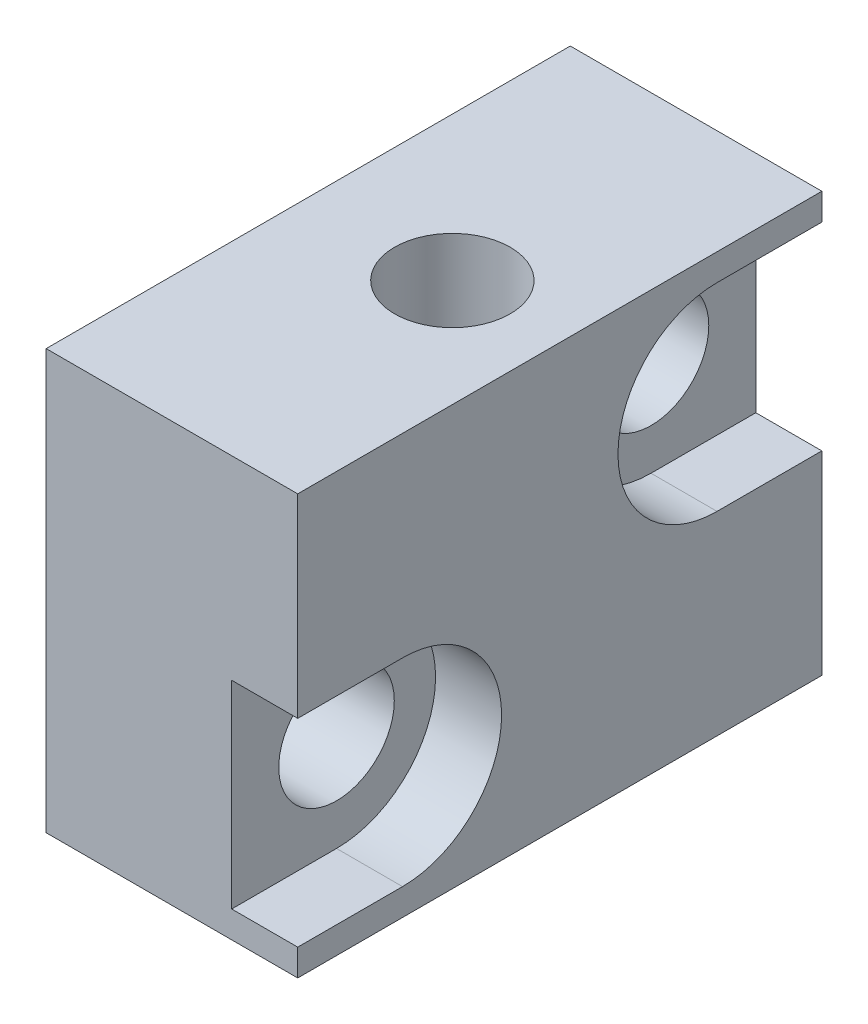
ISO-10303-21;
HEADER;
FILE_DESCRIPTION(('STEP AP214'),'2;1');
FILE_NAME('part.step','',(''),(''),'','','');
FILE_SCHEMA(('AUTOMOTIVE_DESIGN { 1 0 10303 214 1 1 1 1 }'));
ENDSEC;
DATA;
#1=APPLICATION_CONTEXT('core data for automotive mechanical design processes');
#2=APPLICATION_PROTOCOL_DEFINITION('international standard','automotive_design',2000,#1);
#3=PRODUCT_CONTEXT('',#1,'mechanical');
#4=PRODUCT('Part','Part','',(#3));
#5=PRODUCT_RELATED_PRODUCT_CATEGORY('part','',(#4));
#6=PRODUCT_DEFINITION_FORMATION('','',#4);
#7=PRODUCT_DEFINITION_CONTEXT('part definition',#1,'design');
#8=PRODUCT_DEFINITION('design','',#6,#7);
#9=PRODUCT_DEFINITION_SHAPE('','',#8);
#10=(LENGTH_UNIT() NAMED_UNIT(*) SI_UNIT(.MILLI.,.METRE.));
#11=(NAMED_UNIT(*) PLANE_ANGLE_UNIT() SI_UNIT($,.RADIAN.));
#12=(NAMED_UNIT(*) SI_UNIT($,.STERADIAN.) SOLID_ANGLE_UNIT());
#13=UNCERTAINTY_MEASURE_WITH_UNIT(LENGTH_MEASURE(1.E-05),#10,'distance_accuracy_value','');
#14=(GEOMETRIC_REPRESENTATION_CONTEXT(3) GLOBAL_UNCERTAINTY_ASSIGNED_CONTEXT((#13)) GLOBAL_UNIT_ASSIGNED_CONTEXT((#10,
#11,#12)) REPRESENTATION_CONTEXT('',''));
#15=CARTESIAN_POINT('',(0.,0.,0.));
#16=DIRECTION('',(0.,0.,1.));
#17=DIRECTION('',(1.,0.,0.));
#18=AXIS2_PLACEMENT_3D('',#15,#16,#17);
#19=CARTESIAN_POINT('',(7.62,6.35,-7.9375));
#20=DIRECTION('',(0.,0.,1.));
#21=DIRECTION('',(0.,-1.,0.));
#22=AXIS2_PLACEMENT_3D('',#19,#20,#21);
#23=PLANE('',#22);
#24=DIRECTION('',(1.,0.,0.));
#25=VECTOR('',#24,1.);
#26=CARTESIAN_POINT('',(5.62,5.54,-7.9375));
#27=LINE('',#26,#25);
#28=CARTESIAN_POINT('',(5.62,5.54,-7.9375));
#29=VERTEX_POINT('',#28);
#30=CARTESIAN_POINT('',(7.62,5.54,-7.9375));
#31=VERTEX_POINT('',#30);
#32=EDGE_CURVE('E218',#29,#31,#27,.T.);
#33=ORIENTED_EDGE('',*,*,#32,.F.);
#34=DIRECTION('',(0.,1.,0.));
#35=VECTOR('',#34,1.);
#36=CARTESIAN_POINT('',(5.62,0.,-7.9375));
#37=LINE('',#36,#35);
#38=CARTESIAN_POINT('',(5.62,-0.46,-7.9375));
#39=VERTEX_POINT('',#38);
#40=EDGE_CURVE('E200',#39,#29,#37,.T.);
#41=ORIENTED_EDGE('',*,*,#40,.F.);
#42=DIRECTION('',(1.,0.,0.));
#43=VECTOR('',#42,1.);
#44=CARTESIAN_POINT('',(5.62,-0.46,-7.9375));
#45=LINE('',#44,#43);
#46=CARTESIAN_POINT('',(7.62,-0.46,-7.9375));
#47=VERTEX_POINT('',#46);
#48=EDGE_CURVE('E221',#39,#47,#45,.T.);
#49=ORIENTED_EDGE('',*,*,#48,.T.);
#50=DIRECTION('',(0.,1.,0.));
#51=VECTOR('',#50,1.);
#52=CARTESIAN_POINT('',(7.62,6.35,-7.9375));
#53=LINE('',#52,#51);
#54=CARTESIAN_POINT('',(7.62,-6.35,-7.9375));
#55=VERTEX_POINT('',#54);
#56=EDGE_CURVE('E237',#55,#47,#53,.T.);
#57=ORIENTED_EDGE('',*,*,#56,.F.);
#58=DIRECTION('',(-1.,0.,0.));
#59=VECTOR('',#58,1.);
#60=CARTESIAN_POINT('',(7.62,-6.35,-7.9375));
#61=LINE('',#60,#59);
#62=CARTESIAN_POINT('',(0.,-6.35,-7.9375));
#63=VERTEX_POINT('',#62);
#64=EDGE_CURVE('E11',#55,#63,#61,.T.);
#65=ORIENTED_EDGE('',*,*,#64,.T.);
#66=DIRECTION('',(0.,1.,0.));
#67=VECTOR('',#66,1.);
#68=CARTESIAN_POINT('',(0.,6.35,-7.9375));
#69=LINE('',#68,#67);
#70=CARTESIAN_POINT('',(0.,6.35,-7.9375));
#71=VERTEX_POINT('',#70);
#72=EDGE_CURVE('E254',#63,#71,#69,.T.);
#73=ORIENTED_EDGE('',*,*,#72,.T.);
#74=DIRECTION('',(-1.,0.,0.));
#75=VECTOR('',#74,1.);
#76=CARTESIAN_POINT('',(7.62,6.35,-7.9375));
#77=LINE('',#76,#75);
#78=CARTESIAN_POINT('',(7.62,6.35,-7.9375));
#79=VERTEX_POINT('',#78);
#80=EDGE_CURVE('E52',#79,#71,#77,.T.);
#81=ORIENTED_EDGE('',*,*,#80,.F.);
#82=EDGE_CURVE('E235',#31,#79,#53,.T.);
#83=ORIENTED_EDGE('',*,*,#82,.F.);
#84=EDGE_LOOP('',(#33,#41,#49,#57,#65,#73,#81,#83));
#85=FACE_BOUND('',#84,.T.);
#86=ADVANCED_FACE('F42',(#85),#23,.F.);
#87=CARTESIAN_POINT('',(7.62,6.35,7.9375));
#88=DIRECTION('',(0.,0.,-1.));
#89=DIRECTION('',(0.,1.,0.));
#90=AXIS2_PLACEMENT_3D('',#87,#88,#89);
#91=PLANE('',#90);
#92=DIRECTION('',(1.,0.,0.));
#93=VECTOR('',#92,1.);
#94=CARTESIAN_POINT('',(5.62,-5.54,7.9375));
#95=LINE('',#94,#93);
#96=CARTESIAN_POINT('',(5.62,-5.54,7.9375));
#97=VERTEX_POINT('',#96);
#98=CARTESIAN_POINT('',(7.62,-5.54,7.9375));
#99=VERTEX_POINT('',#98);
#100=EDGE_CURVE('E183',#97,#99,#95,.T.);
#101=ORIENTED_EDGE('',*,*,#100,.F.);
#102=DIRECTION('',(0.,-1.,0.));
#103=VECTOR('',#102,1.);
#104=CARTESIAN_POINT('',(5.62,0.,7.9375));
#105=LINE('',#104,#103);
#106=CARTESIAN_POINT('',(5.62,0.459999999999999,7.9375));
#107=VERTEX_POINT('',#106);
#108=EDGE_CURVE('E146',#107,#97,#105,.T.);
#109=ORIENTED_EDGE('',*,*,#108,.F.);
#110=DIRECTION('',(1.,0.,0.));
#111=VECTOR('',#110,1.);
#112=CARTESIAN_POINT('',(5.62,0.459999999999999,7.9375));
#113=LINE('',#112,#111);
#114=CARTESIAN_POINT('',(7.62,0.459999999999999,7.9375));
#115=VERTEX_POINT('',#114);
#116=EDGE_CURVE('E140',#107,#115,#113,.T.);
#117=ORIENTED_EDGE('',*,*,#116,.T.);
#118=DIRECTION('',(0.,-1.,0.));
#119=VECTOR('',#118,1.);
#120=CARTESIAN_POINT('',(7.62,6.35,7.9375));
#121=LINE('',#120,#119);
#122=CARTESIAN_POINT('',(7.62,6.35,7.9375));
#123=VERTEX_POINT('',#122);
#124=EDGE_CURVE('E245',#123,#115,#121,.T.);
#125=ORIENTED_EDGE('',*,*,#124,.F.);
#126=DIRECTION('',(-1.,0.,0.));
#127=VECTOR('',#126,1.);
#128=CARTESIAN_POINT('',(7.62,6.35,7.9375));
#129=LINE('',#128,#127);
#130=CARTESIAN_POINT('',(0.,6.35,7.9375));
#131=VERTEX_POINT('',#130);
#132=EDGE_CURVE('E265',#123,#131,#129,.T.);
#133=ORIENTED_EDGE('',*,*,#132,.T.);
#134=DIRECTION('',(0.,-1.,0.));
#135=VECTOR('',#134,1.);
#136=CARTESIAN_POINT('',(0.,6.35,7.9375));
#137=LINE('',#136,#135);
#138=CARTESIAN_POINT('',(0.,-6.35,7.9375));
#139=VERTEX_POINT('',#138);
#140=EDGE_CURVE('E236',#131,#139,#137,.T.);
#141=ORIENTED_EDGE('',*,*,#140,.T.);
#142=DIRECTION('',(-1.,0.,0.));
#143=VECTOR('',#142,1.);
#144=CARTESIAN_POINT('',(7.62,-6.35,7.9375));
#145=LINE('',#144,#143);
#146=CARTESIAN_POINT('',(7.62,-6.35,7.9375));
#147=VERTEX_POINT('',#146);
#148=EDGE_CURVE('E249',#147,#139,#145,.T.);
#149=ORIENTED_EDGE('',*,*,#148,.F.);
#150=EDGE_CURVE('E244',#99,#147,#121,.T.);
#151=ORIENTED_EDGE('',*,*,#150,.F.);
#152=EDGE_LOOP('',(#101,#109,#117,#125,#133,#141,#149,#151));
#153=FACE_BOUND('',#152,.T.);
#154=ADVANCED_FACE('F304',(#153),#91,.F.);
#155=CARTESIAN_POINT('',(7.62,0.,0.));
#156=DIRECTION('',(1.,0.,0.));
#157=DIRECTION('',(0.,0.,-1.));
#158=AXIS2_PLACEMENT_3D('',#155,#156,#157);
#159=PLANE('',#158);
#160=CARTESIAN_POINT('',(7.62,-2.54,4.7625));
#161=DIRECTION('',(1.,0.,0.));
#162=DIRECTION('',(0.,0.,-1.));
#163=AXIS2_PLACEMENT_3D('',#160,#161,#162);
#164=CIRCLE('',#163,3.);
#165=CARTESIAN_POINT('',(7.62,-5.54,4.7625));
#166=VERTEX_POINT('',#165);
#167=CARTESIAN_POINT('',(7.62,0.46,4.7625));
#168=VERTEX_POINT('',#167);
#169=EDGE_CURVE('E60',#166,#168,#164,.T.);
#170=ORIENTED_EDGE('',*,*,#169,.F.);
#171=DIRECTION('',(0.,0.,1.));
#172=VECTOR('',#171,1.);
#173=CARTESIAN_POINT('',(7.62,-5.54,0.));
#174=LINE('',#173,#172);
#175=EDGE_CURVE('E163',#166,#99,#174,.T.);
#176=ORIENTED_EDGE('',*,*,#175,.T.);
#177=ORIENTED_EDGE('',*,*,#150,.T.);
#178=DIRECTION('',(0.,0.,-1.));
#179=VECTOR('',#178,1.);
#180=CARTESIAN_POINT('',(7.62,-6.35,-7.9375));
#181=LINE('',#180,#179);
#182=EDGE_CURVE('E232',#147,#55,#181,.T.);
#183=ORIENTED_EDGE('',*,*,#182,.T.);
#184=ORIENTED_EDGE('',*,*,#56,.T.);
#185=DIRECTION('',(0.,0.,1.));
#186=VECTOR('',#185,1.);
#187=CARTESIAN_POINT('',(7.62,-0.459999999999999,0.));
#188=LINE('',#187,#186);
#189=CARTESIAN_POINT('',(7.62,-0.46,-4.7625));
#190=VERTEX_POINT('',#189);
#191=EDGE_CURVE('E209',#47,#190,#188,.T.);
#192=ORIENTED_EDGE('',*,*,#191,.T.);
#193=CARTESIAN_POINT('',(7.62,2.54,-4.7625));
#194=DIRECTION('',(1.,0.,0.));
#195=DIRECTION('',(0.,0.,-1.));
#196=AXIS2_PLACEMENT_3D('',#193,#194,#195);
#197=CIRCLE('',#196,3.);
#198=CARTESIAN_POINT('',(7.62,5.54,-4.7625));
#199=VERTEX_POINT('',#198);
#200=EDGE_CURVE('E68',#199,#190,#197,.T.);
#201=ORIENTED_EDGE('',*,*,#200,.F.);
#202=DIRECTION('',(0.,0.,-1.));
#203=VECTOR('',#202,1.);
#204=CARTESIAN_POINT('',(7.62,5.54,0.));
#205=LINE('',#204,#203);
#206=EDGE_CURVE('E193',#199,#31,#205,.T.);
#207=ORIENTED_EDGE('',*,*,#206,.T.);
#208=ORIENTED_EDGE('',*,*,#82,.T.);
#209=DIRECTION('',(0.,0.,1.));
#210=VECTOR('',#209,1.);
#211=CARTESIAN_POINT('',(7.62,6.35,-7.9375));
#212=LINE('',#211,#210);
#213=EDGE_CURVE('E241',#79,#123,#212,.T.);
#214=ORIENTED_EDGE('',*,*,#213,.T.);
#215=ORIENTED_EDGE('',*,*,#124,.T.);
#216=DIRECTION('',(0.,0.,-1.));
#217=VECTOR('',#216,1.);
#218=CARTESIAN_POINT('',(7.62,0.460000000000001,0.));
#219=LINE('',#218,#217);
#220=EDGE_CURVE('E172',#115,#168,#219,.T.);
#221=ORIENTED_EDGE('',*,*,#220,.T.);
#222=EDGE_LOOP('',(#170,#176,#177,#183,#184,#192,#201,#207,#208,#214,#215,#221));
#223=FACE_BOUND('',#222,.T.);
#224=ADVANCED_FACE('F308',(#223),#159,.T.);
#225=CARTESIAN_POINT('',(-14.6685,2.54,-4.7625));
#226=DIRECTION('',(1.,0.,0.));
#227=DIRECTION('',(0.,0.,-1.));
#228=AXIS2_PLACEMENT_3D('',#225,#226,#227);
#229=CYLINDRICAL_SURFACE('',#228,1.75);
#230=CARTESIAN_POINT('',(0.,2.54,-4.7625));
#231=DIRECTION('',(1.,0.,0.));
#232=DIRECTION('',(0.,0.,-1.));
#233=AXIS2_PLACEMENT_3D('',#230,#231,#232);
#234=CIRCLE('',#233,1.75);
#235=CARTESIAN_POINT('',(0.,2.54,-6.5125));
#236=VERTEX_POINT('',#235);
#237=EDGE_CURVE('E182',#236,#236,#234,.T.);
#238=ORIENTED_EDGE('',*,*,#237,.F.);
#239=EDGE_LOOP('',(#238));
#240=FACE_BOUND('',#239,.T.);
#241=CARTESIAN_POINT('',(5.62,2.54,-4.7625));
#242=DIRECTION('',(1.,0.,0.));
#243=DIRECTION('',(0.,0.,-1.));
#244=AXIS2_PLACEMENT_3D('',#241,#242,#243);
#245=CIRCLE('',#244,1.75);
#246=CARTESIAN_POINT('',(5.62,2.54,-6.5125));
#247=VERTEX_POINT('',#246);
#248=EDGE_CURVE('E188',#247,#247,#245,.F.);
#249=ORIENTED_EDGE('',*,*,#248,.F.);
#250=EDGE_LOOP('',(#249));
#251=FACE_BOUND('',#250,.T.);
#252=ADVANCED_FACE('F288',(#240,#251),#229,.F.);
#253=CARTESIAN_POINT('',(-14.6685,-2.54,4.7625));
#254=DIRECTION('',(1.,0.,0.));
#255=DIRECTION('',(0.,0.,-1.));
#256=AXIS2_PLACEMENT_3D('',#253,#254,#255);
#257=CYLINDRICAL_SURFACE('',#256,1.75);
#258=CARTESIAN_POINT('',(0.,-2.54,4.7625));
#259=DIRECTION('',(1.,0.,0.));
#260=DIRECTION('',(0.,0.,-1.));
#261=AXIS2_PLACEMENT_3D('',#258,#259,#260);
#262=CIRCLE('',#261,1.75);
#263=CARTESIAN_POINT('',(0.,-2.54,3.0125));
#264=VERTEX_POINT('',#263);
#265=EDGE_CURVE('E46',#264,#264,#262,.T.);
#266=ORIENTED_EDGE('',*,*,#265,.F.);
#267=EDGE_LOOP('',(#266));
#268=FACE_BOUND('',#267,.T.);
#269=CARTESIAN_POINT('',(5.62,-2.54,4.7625));
#270=DIRECTION('',(1.,0.,0.));
#271=DIRECTION('',(0.,0.,-1.));
#272=AXIS2_PLACEMENT_3D('',#269,#270,#271);
#273=CIRCLE('',#272,1.75);
#274=CARTESIAN_POINT('',(5.62,-2.54,3.0125));
#275=VERTEX_POINT('',#274);
#276=EDGE_CURVE('E157',#275,#275,#273,.F.);
#277=ORIENTED_EDGE('',*,*,#276,.F.);
#278=EDGE_LOOP('',(#277));
#279=FACE_BOUND('',#278,.T.);
#280=ADVANCED_FACE('F285',(#268,#279),#257,.F.);
#281=CARTESIAN_POINT('',(7.62,-6.35,-7.9375));
#282=DIRECTION('',(0.,1.,0.));
#283=DIRECTION('',(0.,0.,1.));
#284=AXIS2_PLACEMENT_3D('',#281,#282,#283);
#285=PLANE('',#284);
#286=CARTESIAN_POINT('',(4.36625,-6.35,0.));
#287=DIRECTION('',(0.,-1.,0.));
#288=DIRECTION('',(0.,0.,-1.));
#289=AXIS2_PLACEMENT_3D('',#286,#287,#288);
#290=CIRCLE('',#289,1.75);
#291=CARTESIAN_POINT('',(4.36625,-6.35,-1.75));
#292=VERTEX_POINT('',#291);
#293=EDGE_CURVE('E227',#292,#292,#290,.T.);
#294=ORIENTED_EDGE('',*,*,#293,.F.);
#295=EDGE_LOOP('',(#294));
#296=FACE_BOUND('',#295,.T.);
#297=DIRECTION('',(0.,0.,-1.));
#298=VECTOR('',#297,1.);
#299=CARTESIAN_POINT('',(0.,-6.35,-7.9375));
#300=LINE('',#299,#298);
#301=EDGE_CURVE('E250',#139,#63,#300,.T.);
#302=ORIENTED_EDGE('',*,*,#301,.T.);
#303=ORIENTED_EDGE('',*,*,#64,.F.);
#304=ORIENTED_EDGE('',*,*,#182,.F.);
#305=ORIENTED_EDGE('',*,*,#148,.T.);
#306=EDGE_LOOP('',(#302,#303,#304,#305));
#307=FACE_BOUND('',#306,.T.);
#308=ADVANCED_FACE('F44',(#296,#307),#285,.F.);
#309=CARTESIAN_POINT('',(7.62,6.35,-7.9375));
#310=DIRECTION('',(0.,-1.,0.));
#311=DIRECTION('',(0.,0.,-1.));
#312=AXIS2_PLACEMENT_3D('',#309,#310,#311);
#313=PLANE('',#312);
#314=CARTESIAN_POINT('',(4.36625,6.35,0.));
#315=DIRECTION('',(0.,-1.,0.));
#316=DIRECTION('',(0.,0.,-1.));
#317=AXIS2_PLACEMENT_3D('',#314,#315,#316);
#318=CIRCLE('',#317,1.75);
#319=CARTESIAN_POINT('',(4.36625,6.35,-1.75));
#320=VERTEX_POINT('',#319);
#321=EDGE_CURVE('E231',#320,#320,#318,.T.);
#322=ORIENTED_EDGE('',*,*,#321,.T.);
#323=EDGE_LOOP('',(#322));
#324=FACE_BOUND('',#323,.T.);
#325=DIRECTION('',(0.,0.,1.));
#326=VECTOR('',#325,1.);
#327=CARTESIAN_POINT('',(0.,6.35,-7.9375));
#328=LINE('',#327,#326);
#329=EDGE_CURVE('E257',#71,#131,#328,.T.);
#330=ORIENTED_EDGE('',*,*,#329,.T.);
#331=ORIENTED_EDGE('',*,*,#132,.F.);
#332=ORIENTED_EDGE('',*,*,#213,.F.);
#333=ORIENTED_EDGE('',*,*,#80,.T.);
#334=EDGE_LOOP('',(#330,#331,#332,#333));
#335=FACE_BOUND('',#334,.T.);
#336=ADVANCED_FACE('F313',(#324,#335),#313,.F.);
#337=CARTESIAN_POINT('',(0.,0.,0.));
#338=DIRECTION('',(1.,0.,0.));
#339=DIRECTION('',(0.,0.,-1.));
#340=AXIS2_PLACEMENT_3D('',#337,#338,#339);
#341=PLANE('',#340);
#342=ORIENTED_EDGE('',*,*,#265,.T.);
#343=EDGE_LOOP('',(#342));
#344=FACE_BOUND('',#343,.T.);
#345=ORIENTED_EDGE('',*,*,#237,.T.);
#346=EDGE_LOOP('',(#345));
#347=FACE_BOUND('',#346,.T.);
#348=ORIENTED_EDGE('',*,*,#301,.F.);
#349=ORIENTED_EDGE('',*,*,#140,.F.);
#350=ORIENTED_EDGE('',*,*,#329,.F.);
#351=ORIENTED_EDGE('',*,*,#72,.F.);
#352=EDGE_LOOP('',(#348,#349,#350,#351));
#353=FACE_BOUND('',#352,.T.);
#354=ADVANCED_FACE('F283',(#344,#347,#353),#341,.F.);
#355=CARTESIAN_POINT('',(4.36625,15.9385,0.));
#356=DIRECTION('',(0.,-1.,0.));
#357=DIRECTION('',(0.,0.,-1.));
#358=AXIS2_PLACEMENT_3D('',#355,#356,#357);
#359=CYLINDRICAL_SURFACE('',#358,1.75);
#360=ORIENTED_EDGE('',*,*,#293,.T.);
#361=EDGE_LOOP('',(#360));
#362=FACE_BOUND('',#361,.T.);
#363=ORIENTED_EDGE('',*,*,#321,.F.);
#364=EDGE_LOOP('',(#363));
#365=FACE_BOUND('',#364,.T.);
#366=ADVANCED_FACE('F319',(#362,#365),#359,.F.);
#367=CARTESIAN_POINT('',(5.62,-2.54,4.7625));
#368=DIRECTION('',(1.,0.,0.));
#369=DIRECTION('',(0.,0.,-1.));
#370=AXIS2_PLACEMENT_3D('',#367,#368,#369);
#371=CYLINDRICAL_SURFACE('',#370,3.);
#372=ORIENTED_EDGE('',*,*,#169,.T.);
#373=DIRECTION('',(1.,0.,0.));
#374=VECTOR('',#373,1.);
#375=CARTESIAN_POINT('',(5.62,0.46,4.7625));
#376=LINE('',#375,#374);
#377=CARTESIAN_POINT('',(5.62,0.46,4.7625));
#378=VERTEX_POINT('',#377);
#379=EDGE_CURVE('E137',#378,#168,#376,.T.);
#380=ORIENTED_EDGE('',*,*,#379,.F.);
#381=CARTESIAN_POINT('',(5.62,-2.54,4.7625));
#382=DIRECTION('',(1.,0.,0.));
#383=DIRECTION('',(0.,0.,-1.));
#384=AXIS2_PLACEMENT_3D('',#381,#382,#383);
#385=CIRCLE('',#384,3.);
#386=CARTESIAN_POINT('',(5.62,-5.54,4.7625));
#387=VERTEX_POINT('',#386);
#388=EDGE_CURVE('E147',#387,#378,#385,.T.);
#389=ORIENTED_EDGE('',*,*,#388,.F.);
#390=DIRECTION('',(1.,0.,0.));
#391=VECTOR('',#390,1.);
#392=CARTESIAN_POINT('',(5.62,-5.54,4.7625));
#393=LINE('',#392,#391);
#394=EDGE_CURVE('E179',#387,#166,#393,.T.);
#395=ORIENTED_EDGE('',*,*,#394,.T.);
#396=EDGE_LOOP('',(#372,#380,#389,#395));
#397=FACE_BOUND('',#396,.T.);
#398=ADVANCED_FACE('F150',(#397),#371,.F.);
#399=CARTESIAN_POINT('',(5.62,-5.54,0.));
#400=DIRECTION('',(0.,1.,0.));
#401=DIRECTION('',(0.,0.,1.));
#402=AXIS2_PLACEMENT_3D('',#399,#400,#401);
#403=PLANE('',#402);
#404=ORIENTED_EDGE('',*,*,#175,.F.);
#405=ORIENTED_EDGE('',*,*,#394,.F.);
#406=DIRECTION('',(0.,0.,1.));
#407=VECTOR('',#406,1.);
#408=CARTESIAN_POINT('',(5.62,-5.54,0.));
#409=LINE('',#408,#407);
#410=EDGE_CURVE('E152',#387,#97,#409,.T.);
#411=ORIENTED_EDGE('',*,*,#410,.T.);
#412=ORIENTED_EDGE('',*,*,#100,.T.);
#413=EDGE_LOOP('',(#404,#405,#411,#412));
#414=FACE_BOUND('',#413,.T.);
#415=ADVANCED_FACE('F300',(#414),#403,.T.);
#416=CARTESIAN_POINT('',(5.62,0.460000000000001,0.));
#417=DIRECTION('',(0.,-1.,0.));
#418=DIRECTION('',(0.,0.,-1.));
#419=AXIS2_PLACEMENT_3D('',#416,#417,#418);
#420=PLANE('',#419);
#421=ORIENTED_EDGE('',*,*,#220,.F.);
#422=ORIENTED_EDGE('',*,*,#116,.F.);
#423=DIRECTION('',(0.,0.,-1.));
#424=VECTOR('',#423,1.);
#425=CARTESIAN_POINT('',(5.62,0.460000000000001,0.));
#426=LINE('',#425,#424);
#427=EDGE_CURVE('E135',#107,#378,#426,.T.);
#428=ORIENTED_EDGE('',*,*,#427,.T.);
#429=ORIENTED_EDGE('',*,*,#379,.T.);
#430=EDGE_LOOP('',(#421,#422,#428,#429));
#431=FACE_BOUND('',#430,.T.);
#432=ADVANCED_FACE('F136',(#431),#420,.T.);
#433=CARTESIAN_POINT('',(5.62,0.,0.));
#434=DIRECTION('',(1.,0.,0.));
#435=DIRECTION('',(0.,0.,-1.));
#436=AXIS2_PLACEMENT_3D('',#433,#434,#435);
#437=PLANE('',#436);
#438=ORIENTED_EDGE('',*,*,#276,.T.);
#439=EDGE_LOOP('',(#438));
#440=FACE_BOUND('',#439,.T.);
#441=ORIENTED_EDGE('',*,*,#388,.T.);
#442=ORIENTED_EDGE('',*,*,#427,.F.);
#443=ORIENTED_EDGE('',*,*,#108,.T.);
#444=ORIENTED_EDGE('',*,*,#410,.F.);
#445=EDGE_LOOP('',(#441,#442,#443,#444));
#446=FACE_BOUND('',#445,.T.);
#447=ADVANCED_FACE('F155',(#440,#446),#437,.T.);
#448=CARTESIAN_POINT('',(5.62,2.54,-4.7625));
#449=DIRECTION('',(1.,0.,0.));
#450=DIRECTION('',(0.,0.,-1.));
#451=AXIS2_PLACEMENT_3D('',#448,#449,#450);
#452=CYLINDRICAL_SURFACE('',#451,3.);
#453=ORIENTED_EDGE('',*,*,#200,.T.);
#454=DIRECTION('',(1.,0.,0.));
#455=VECTOR('',#454,1.);
#456=CARTESIAN_POINT('',(5.62,-0.46,-4.7625));
#457=LINE('',#456,#455);
#458=CARTESIAN_POINT('',(5.62,-0.46,-4.7625));
#459=VERTEX_POINT('',#458);
#460=EDGE_CURVE('E206',#459,#190,#457,.T.);
#461=ORIENTED_EDGE('',*,*,#460,.F.);
#462=CARTESIAN_POINT('',(5.62,2.54,-4.7625));
#463=DIRECTION('',(1.,0.,0.));
#464=DIRECTION('',(0.,0.,-1.));
#465=AXIS2_PLACEMENT_3D('',#462,#463,#464);
#466=CIRCLE('',#465,3.);
#467=CARTESIAN_POINT('',(5.62,5.54,-4.7625));
#468=VERTEX_POINT('',#467);
#469=EDGE_CURVE('E192',#468,#459,#466,.T.);
#470=ORIENTED_EDGE('',*,*,#469,.F.);
#471=DIRECTION('',(1.,0.,0.));
#472=VECTOR('',#471,1.);
#473=CARTESIAN_POINT('',(5.62,5.54,-4.7625));
#474=LINE('',#473,#472);
#475=EDGE_CURVE('E173',#468,#199,#474,.T.);
#476=ORIENTED_EDGE('',*,*,#475,.T.);
#477=EDGE_LOOP('',(#453,#461,#470,#476));
#478=FACE_BOUND('',#477,.T.);
#479=ADVANCED_FACE('F293',(#478),#452,.F.);
#480=CARTESIAN_POINT('',(5.62,5.54,0.));
#481=DIRECTION('',(0.,-1.,0.));
#482=DIRECTION('',(0.,0.,-1.));
#483=AXIS2_PLACEMENT_3D('',#480,#481,#482);
#484=PLANE('',#483);
#485=ORIENTED_EDGE('',*,*,#206,.F.);
#486=ORIENTED_EDGE('',*,*,#475,.F.);
#487=DIRECTION('',(0.,0.,-1.));
#488=VECTOR('',#487,1.);
#489=CARTESIAN_POINT('',(5.62,5.54,0.));
#490=LINE('',#489,#488);
#491=EDGE_CURVE('E203',#468,#29,#490,.T.);
#492=ORIENTED_EDGE('',*,*,#491,.T.);
#493=ORIENTED_EDGE('',*,*,#32,.T.);
#494=EDGE_LOOP('',(#485,#486,#492,#493));
#495=FACE_BOUND('',#494,.T.);
#496=ADVANCED_FACE('F298',(#495),#484,.T.);
#497=CARTESIAN_POINT('',(5.62,-0.459999999999999,0.));
#498=DIRECTION('',(0.,1.,0.));
#499=DIRECTION('',(0.,0.,1.));
#500=AXIS2_PLACEMENT_3D('',#497,#498,#499);
#501=PLANE('',#500);
#502=ORIENTED_EDGE('',*,*,#191,.F.);
#503=ORIENTED_EDGE('',*,*,#48,.F.);
#504=DIRECTION('',(0.,0.,1.));
#505=VECTOR('',#504,1.);
#506=CARTESIAN_POINT('',(5.62,-0.459999999999999,0.));
#507=LINE('',#506,#505);
#508=EDGE_CURVE('E197',#39,#459,#507,.T.);
#509=ORIENTED_EDGE('',*,*,#508,.T.);
#510=ORIENTED_EDGE('',*,*,#460,.T.);
#511=EDGE_LOOP('',(#502,#503,#509,#510));
#512=FACE_BOUND('',#511,.T.);
#513=ADVANCED_FACE('F329',(#512),#501,.T.);
#514=CARTESIAN_POINT('',(5.62,0.,0.));
#515=DIRECTION('',(1.,0.,0.));
#516=DIRECTION('',(0.,0.,-1.));
#517=AXIS2_PLACEMENT_3D('',#514,#515,#516);
#518=PLANE('',#517);
#519=ORIENTED_EDGE('',*,*,#248,.T.);
#520=EDGE_LOOP('',(#519));
#521=FACE_BOUND('',#520,.T.);
#522=ORIENTED_EDGE('',*,*,#469,.T.);
#523=ORIENTED_EDGE('',*,*,#508,.F.);
#524=ORIENTED_EDGE('',*,*,#40,.T.);
#525=ORIENTED_EDGE('',*,*,#491,.F.);
#526=EDGE_LOOP('',(#522,#523,#524,#525));
#527=FACE_BOUND('',#526,.T.);
#528=ADVANCED_FACE('F332',(#521,#527),#518,.T.);
#529=CLOSED_SHELL('',(#86,#154,#224,#252,#280,#308,#336,#354,#366,#398,#415,#432,#447,#479,#496,
#513,#528));
#530=MANIFOLD_SOLID_BREP('B2',#529);
#531=ADVANCED_BREP_SHAPE_REPRESENTATION('',(#18,#530),#14);
#532=SHAPE_DEFINITION_REPRESENTATION(#9,#531);
ENDSEC;
END-ISO-10303-21;
